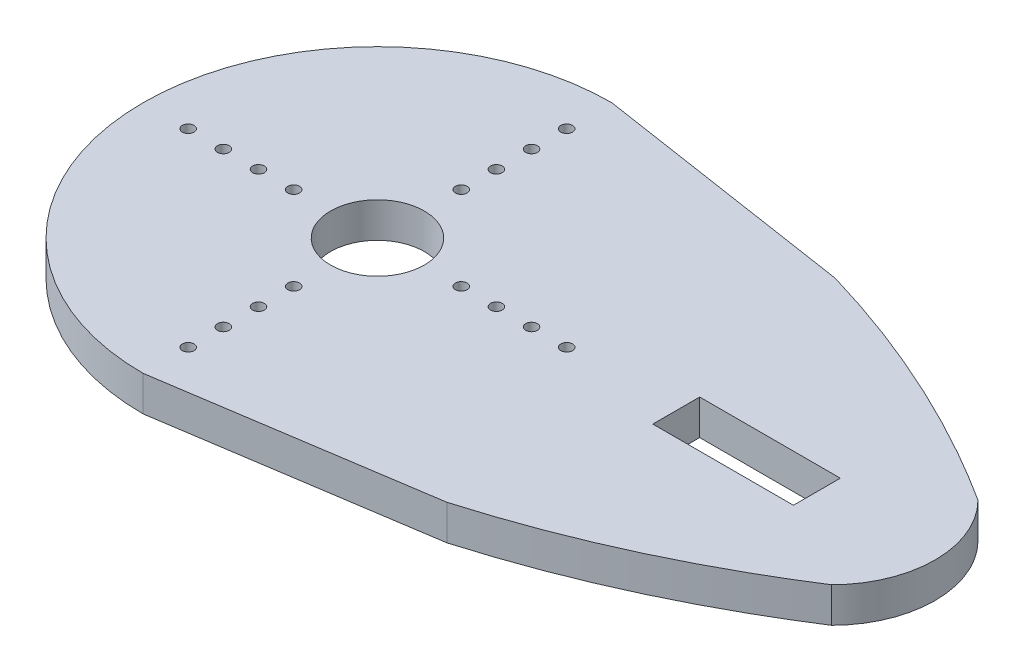
ISO-10303-21;
HEADER;
FILE_DESCRIPTION(('STEP AP214'),'2;1');
FILE_NAME('part.step','',(''),(''),'','','');
FILE_SCHEMA(('AUTOMOTIVE_DESIGN { 1 0 10303 214 1 1 1 1 }'));
ENDSEC;
DATA;
#1=APPLICATION_CONTEXT('core data for automotive mechanical design processes');
#2=APPLICATION_PROTOCOL_DEFINITION('international standard','automotive_design',2000,#1);
#3=PRODUCT_CONTEXT('',#1,'mechanical');
#4=PRODUCT('Part','Part','',(#3));
#5=PRODUCT_RELATED_PRODUCT_CATEGORY('part','',(#4));
#6=PRODUCT_DEFINITION_FORMATION('','',#4);
#7=PRODUCT_DEFINITION_CONTEXT('part definition',#1,'design');
#8=PRODUCT_DEFINITION('design','',#6,#7);
#9=PRODUCT_DEFINITION_SHAPE('','',#8);
#10=(LENGTH_UNIT() NAMED_UNIT(*) SI_UNIT(.MILLI.,.METRE.));
#11=(NAMED_UNIT(*) PLANE_ANGLE_UNIT() SI_UNIT($,.RADIAN.));
#12=(NAMED_UNIT(*) SI_UNIT($,.STERADIAN.) SOLID_ANGLE_UNIT());
#13=UNCERTAINTY_MEASURE_WITH_UNIT(LENGTH_MEASURE(1.E-05),#10,'distance_accuracy_value','');
#14=(GEOMETRIC_REPRESENTATION_CONTEXT(3) GLOBAL_UNCERTAINTY_ASSIGNED_CONTEXT((#13)) GLOBAL_UNIT_ASSIGNED_CONTEXT((#10,
#11,#12)) REPRESENTATION_CONTEXT('',''));
#15=CARTESIAN_POINT('',(0.,0.,0.));
#16=DIRECTION('',(0.,0.,1.));
#17=DIRECTION('',(1.,0.,0.));
#18=AXIS2_PLACEMENT_3D('',#15,#16,#17);
#19=CARTESIAN_POINT('',(0.,3.,2.));
#20=DIRECTION('',(0.,0.,-1.));
#21=DIRECTION('',(-1.,0.,0.));
#22=AXIS2_PLACEMENT_3D('',#19,#20,#21);
#23=PLANE('',#22);
#24=DIRECTION('',(1.,0.,0.));
#25=VECTOR('',#24,1.);
#26=CARTESIAN_POINT('',(0.,0.,2.));
#27=LINE('',#26,#25);
#28=CARTESIAN_POINT('',(25.5,0.,2.));
#29=VERTEX_POINT('',#28);
#30=CARTESIAN_POINT('',(37.5,0.,2.));
#31=VERTEX_POINT('',#30);
#32=EDGE_CURVE('E227',#29,#31,#27,.T.);
#33=ORIENTED_EDGE('',*,*,#32,.F.);
#34=DIRECTION('',(0.,-1.,0.));
#35=VECTOR('',#34,1.);
#36=CARTESIAN_POINT('',(25.5,3.,2.));
#37=LINE('',#36,#35);
#38=CARTESIAN_POINT('',(25.5,3.,2.));
#39=VERTEX_POINT('',#38);
#40=EDGE_CURVE('E11',#39,#29,#37,.T.);
#41=ORIENTED_EDGE('',*,*,#40,.F.);
#42=DIRECTION('',(1.,0.,0.));
#43=VECTOR('',#42,1.);
#44=CARTESIAN_POINT('',(0.,3.,2.));
#45=LINE('',#44,#43);
#46=CARTESIAN_POINT('',(37.5,3.,2.));
#47=VERTEX_POINT('',#46);
#48=EDGE_CURVE('E142',#39,#47,#45,.T.);
#49=ORIENTED_EDGE('',*,*,#48,.T.);
#50=DIRECTION('',(0.,-1.,0.));
#51=VECTOR('',#50,1.);
#52=CARTESIAN_POINT('',(37.5,3.,2.));
#53=LINE('',#52,#51);
#54=EDGE_CURVE('E96',#47,#31,#53,.T.);
#55=ORIENTED_EDGE('',*,*,#54,.T.);
#56=EDGE_LOOP('',(#33,#41,#49,#55));
#57=FACE_BOUND('',#56,.T.);
#58=ADVANCED_FACE('F36',(#57),#23,.T.);
#59=CARTESIAN_POINT('',(25.5,3.,0.));
#60=DIRECTION('',(1.,0.,0.));
#61=DIRECTION('',(0.,0.,-1.));
#62=AXIS2_PLACEMENT_3D('',#59,#60,#61);
#63=PLANE('',#62);
#64=DIRECTION('',(0.,0.,1.));
#65=VECTOR('',#64,1.);
#66=CARTESIAN_POINT('',(25.5,0.,0.));
#67=LINE('',#66,#65);
#68=CARTESIAN_POINT('',(25.5,0.,-2.));
#69=VERTEX_POINT('',#68);
#70=EDGE_CURVE('E131',#69,#29,#67,.T.);
#71=ORIENTED_EDGE('',*,*,#70,.F.);
#72=DIRECTION('',(0.,-1.,0.));
#73=VECTOR('',#72,1.);
#74=CARTESIAN_POINT('',(25.5,3.,-2.));
#75=LINE('',#74,#73);
#76=CARTESIAN_POINT('',(25.5,3.,-2.));
#77=VERTEX_POINT('',#76);
#78=EDGE_CURVE('E46',#77,#69,#75,.T.);
#79=ORIENTED_EDGE('',*,*,#78,.F.);
#80=DIRECTION('',(0.,0.,1.));
#81=VECTOR('',#80,1.);
#82=CARTESIAN_POINT('',(25.5,3.,0.));
#83=LINE('',#82,#81);
#84=EDGE_CURVE('E129',#77,#39,#83,.T.);
#85=ORIENTED_EDGE('',*,*,#84,.T.);
#86=ORIENTED_EDGE('',*,*,#40,.T.);
#87=EDGE_LOOP('',(#71,#79,#85,#86));
#88=FACE_BOUND('',#87,.T.);
#89=ADVANCED_FACE('F127',(#88),#63,.T.);
#90=CARTESIAN_POINT('',(0.,3.,-2.));
#91=DIRECTION('',(0.,0.,-1.));
#92=DIRECTION('',(-1.,0.,0.));
#93=AXIS2_PLACEMENT_3D('',#90,#91,#92);
#94=PLANE('',#93);
#95=DIRECTION('',(1.,0.,0.));
#96=VECTOR('',#95,1.);
#97=CARTESIAN_POINT('',(0.,0.,-2.));
#98=LINE('',#97,#96);
#99=CARTESIAN_POINT('',(37.5,0.,-2.));
#100=VERTEX_POINT('',#99);
#101=EDGE_CURVE('E230',#69,#100,#98,.T.);
#102=ORIENTED_EDGE('',*,*,#101,.T.);
#103=DIRECTION('',(0.,-1.,0.));
#104=VECTOR('',#103,1.);
#105=CARTESIAN_POINT('',(37.5,3.,-2.));
#106=LINE('',#105,#104);
#107=CARTESIAN_POINT('',(37.5,3.,-2.));
#108=VERTEX_POINT('',#107);
#109=EDGE_CURVE('E134',#108,#100,#106,.T.);
#110=ORIENTED_EDGE('',*,*,#109,.F.);
#111=DIRECTION('',(1.,0.,0.));
#112=VECTOR('',#111,1.);
#113=CARTESIAN_POINT('',(0.,3.,-2.));
#114=LINE('',#113,#112);
#115=EDGE_CURVE('E137',#77,#108,#114,.T.);
#116=ORIENTED_EDGE('',*,*,#115,.F.);
#117=ORIENTED_EDGE('',*,*,#78,.T.);
#118=EDGE_LOOP('',(#102,#110,#116,#117));
#119=FACE_BOUND('',#118,.T.);
#120=ADVANCED_FACE('F138',(#119),#94,.F.);
#121=CARTESIAN_POINT('',(0.,3.,20.));
#122=CARTESIAN_POINT('',(24.387763313693,3.,19.4352610275612));
#123=CARTESIAN_POINT('',(45.,3.,6.25));
#124=B_SPLINE_CURVE_WITH_KNOTS('',2,(#121,#122,#123),.UNSPECIFIED.,.F.,.F.,(3,3),(0.,1.),.UNSPECIFIED.);
#125=DIRECTION('',(0.,-1.,0.));
#126=VECTOR('',#125,1.);
#127=SURFACE_OF_LINEAR_EXTRUSION('',#124,#126);
#128=CARTESIAN_POINT('',(0.,0.,20.));
#129=CARTESIAN_POINT('',(24.387763313693,0.,19.4352610275612));
#130=CARTESIAN_POINT('',(45.,0.,6.25));
#131=B_SPLINE_CURVE_WITH_KNOTS('',2,(#128,#129,#130),.UNSPECIFIED.,.F.,.F.,(3,3),(0.,1.),.UNSPECIFIED.);
#132=CARTESIAN_POINT('',(22.4999998561872,0.,16.5625000219714));
#133=VERTEX_POINT('',#132);
#134=CARTESIAN_POINT('',(45.,0.,6.25));
#135=VERTEX_POINT('',#134);
#136=EDGE_CURVE('E180',#133,#135,#131,.T.);
#137=ORIENTED_EDGE('',*,*,#136,.T.);
#138=DIRECTION('',(0.,-1.,0.));
#139=VECTOR('',#138,1.);
#140=CARTESIAN_POINT('',(45.,3.,6.25));
#141=LINE('',#140,#139);
#142=CARTESIAN_POINT('',(45.,3.,6.25));
#143=VERTEX_POINT('',#142);
#144=EDGE_CURVE('E40',#143,#135,#141,.T.);
#145=ORIENTED_EDGE('',*,*,#144,.F.);
#146=CARTESIAN_POINT('',(22.4999998561872,3.,16.5625000219714));
#147=VERTEX_POINT('',#146);
#148=EDGE_CURVE('E104',#147,#143,#124,.T.);
#149=ORIENTED_EDGE('',*,*,#148,.F.);
#150=DIRECTION('',(0.,-1.,0.));
#151=VECTOR('',#150,1.);
#152=CARTESIAN_POINT('',(22.4999998561872,3.,16.5625000219714));
#153=LINE('',#152,#151);
#154=EDGE_CURVE('E164',#147,#133,#153,.T.);
#155=ORIENTED_EDGE('',*,*,#154,.T.);
#156=EDGE_LOOP('',(#137,#145,#149,#155));
#157=FACE_BOUND('',#156,.T.);
#158=ADVANCED_FACE('F270',(#157),#127,.F.);
#159=CARTESIAN_POINT('',(38.75,3.,0.));
#160=DIRECTION('',(0.,-1.,0.));
#161=DIRECTION('',(0.,0.,-1.));
#162=AXIS2_PLACEMENT_3D('',#159,#160,#161);
#163=CYLINDRICAL_SURFACE('',#162,8.83883476483185);
#164=CARTESIAN_POINT('',(38.75,0.,0.));
#165=DIRECTION('',(0.,1.,0.));
#166=DIRECTION('',(0.,0.,1.));
#167=AXIS2_PLACEMENT_3D('',#164,#165,#166);
#168=CIRCLE('',#167,8.83883476483185);
#169=CARTESIAN_POINT('',(45.,0.,-6.25));
#170=VERTEX_POINT('',#169);
#171=EDGE_CURVE('E185',#170,#135,#168,.F.);
#172=ORIENTED_EDGE('',*,*,#171,.F.);
#173=DIRECTION('',(0.,-1.,0.));
#174=VECTOR('',#173,1.);
#175=CARTESIAN_POINT('',(45.,3.,-6.25));
#176=LINE('',#175,#174);
#177=CARTESIAN_POINT('',(45.,3.,-6.25));
#178=VERTEX_POINT('',#177);
#179=EDGE_CURVE('E259',#178,#170,#176,.T.);
#180=ORIENTED_EDGE('',*,*,#179,.F.);
#181=CARTESIAN_POINT('',(38.75,3.,0.));
#182=DIRECTION('',(0.,1.,0.));
#183=DIRECTION('',(0.,0.,1.));
#184=AXIS2_PLACEMENT_3D('',#181,#182,#183);
#185=CIRCLE('',#184,8.83883476483185);
#186=EDGE_CURVE('E267',#178,#143,#185,.F.);
#187=ORIENTED_EDGE('',*,*,#186,.T.);
#188=ORIENTED_EDGE('',*,*,#144,.T.);
#189=EDGE_LOOP('',(#172,#180,#187,#188));
#190=FACE_BOUND('',#189,.T.);
#191=ADVANCED_FACE('F266',(#190),#163,.T.);
#192=CARTESIAN_POINT('',(0.,3.,-20.));
#193=CARTESIAN_POINT('',(24.387763313693,3.,-19.4352610275612));
#194=CARTESIAN_POINT('',(45.,3.,-6.25));
#195=B_SPLINE_CURVE_WITH_KNOTS('',2,(#192,#193,#194),.UNSPECIFIED.,.F.,.F.,(3,3),(0.,1.),.UNSPECIFIED.);
#196=DIRECTION('',(0.,-1.,0.));
#197=VECTOR('',#196,1.);
#198=SURFACE_OF_LINEAR_EXTRUSION('',#195,#197);
#199=CARTESIAN_POINT('',(0.,0.,-20.));
#200=CARTESIAN_POINT('',(24.387763313693,0.,-19.4352610275612));
#201=CARTESIAN_POINT('',(45.,0.,-6.25));
#202=B_SPLINE_CURVE_WITH_KNOTS('',2,(#199,#200,#201),.UNSPECIFIED.,.F.,.F.,(3,3),(0.,1.),.UNSPECIFIED.);
#203=CARTESIAN_POINT('',(22.4999998561872,0.,-16.5625000219714));
#204=VERTEX_POINT('',#203);
#205=EDGE_CURVE('E191',#204,#170,#202,.T.);
#206=ORIENTED_EDGE('',*,*,#205,.F.);
#207=DIRECTION('',(0.,-1.,0.));
#208=VECTOR('',#207,1.);
#209=CARTESIAN_POINT('',(22.4999998561872,3.,-16.5625000219714));
#210=LINE('',#209,#208);
#211=CARTESIAN_POINT('',(22.4999998561872,3.,-16.5625000219714));
#212=VERTEX_POINT('',#211);
#213=EDGE_CURVE('E258',#212,#204,#210,.T.);
#214=ORIENTED_EDGE('',*,*,#213,.F.);
#215=EDGE_CURVE('E280',#212,#178,#195,.T.);
#216=ORIENTED_EDGE('',*,*,#215,.T.);
#217=ORIENTED_EDGE('',*,*,#179,.T.);
#218=EDGE_LOOP('',(#206,#214,#216,#217));
#219=FACE_BOUND('',#218,.T.);
#220=ADVANCED_FACE('F278',(#219),#198,.T.);
#221=CARTESIAN_POINT('',(2.98586239396795,3.,-19.5438265786993));
#222=DIRECTION('',(0.151025398741513,0.,-0.988529882671721));
#223=DIRECTION('',(-0.988529882671721,0.,-0.151025398741513));
#224=AXIS2_PLACEMENT_3D('',#221,#222,#223);
#225=PLANE('',#224);
#226=DIRECTION('',(0.988529882671721,0.,0.151025398741513));
#227=VECTOR('',#226,1.);
#228=CARTESIAN_POINT('',(2.98586239396795,0.,-19.5438265786993));
#229=LINE('',#228,#227);
#230=CARTESIAN_POINT('',(0.,0.,-20.));
#231=VERTEX_POINT('',#230);
#232=EDGE_CURVE('E196',#231,#204,#229,.T.);
#233=ORIENTED_EDGE('',*,*,#232,.F.);
#234=DIRECTION('',(0.,-1.,0.));
#235=VECTOR('',#234,1.);
#236=CARTESIAN_POINT('',(0.,3.,-20.));
#237=LINE('',#236,#235);
#238=CARTESIAN_POINT('',(0.,3.,-20.));
#239=VERTEX_POINT('',#238);
#240=EDGE_CURVE('E256',#239,#231,#237,.T.);
#241=ORIENTED_EDGE('',*,*,#240,.F.);
#242=DIRECTION('',(0.988529882671721,0.,0.151025398741513));
#243=VECTOR('',#242,1.);
#244=CARTESIAN_POINT('',(2.98586239396795,3.,-19.5438265786993));
#245=LINE('',#244,#243);
#246=EDGE_CURVE('E285',#239,#212,#245,.T.);
#247=ORIENTED_EDGE('',*,*,#246,.T.);
#248=ORIENTED_EDGE('',*,*,#213,.T.);
#249=EDGE_LOOP('',(#233,#241,#247,#248));
#250=FACE_BOUND('',#249,.T.);
#251=ADVANCED_FACE('F287',(#250),#225,.T.);
#252=CARTESIAN_POINT('',(0.,3.,0.));
#253=DIRECTION('',(0.,-1.,0.));
#254=DIRECTION('',(0.,0.,-1.));
#255=AXIS2_PLACEMENT_3D('',#252,#253,#254);
#256=CYLINDRICAL_SURFACE('',#255,20.);
#257=CARTESIAN_POINT('',(0.,0.,0.));
#258=DIRECTION('',(0.,1.,0.));
#259=DIRECTION('',(0.,0.,1.));
#260=AXIS2_PLACEMENT_3D('',#257,#258,#259);
#261=CIRCLE('',#260,20.);
#262=CARTESIAN_POINT('',(0.,0.,20.));
#263=VERTEX_POINT('',#262);
#264=EDGE_CURVE('E202',#231,#263,#261,.T.);
#265=ORIENTED_EDGE('',*,*,#264,.T.);
#266=DIRECTION('',(0.,-1.,0.));
#267=VECTOR('',#266,1.);
#268=CARTESIAN_POINT('',(0.,3.,20.));
#269=LINE('',#268,#267);
#270=CARTESIAN_POINT('',(0.,3.,20.));
#271=VERTEX_POINT('',#270);
#272=EDGE_CURVE('E253',#271,#263,#269,.T.);
#273=ORIENTED_EDGE('',*,*,#272,.F.);
#274=CARTESIAN_POINT('',(0.,3.,0.));
#275=DIRECTION('',(0.,1.,0.));
#276=DIRECTION('',(0.,0.,1.));
#277=AXIS2_PLACEMENT_3D('',#274,#275,#276);
#278=CIRCLE('',#277,20.);
#279=EDGE_CURVE('E289',#239,#271,#278,.T.);
#280=ORIENTED_EDGE('',*,*,#279,.F.);
#281=ORIENTED_EDGE('',*,*,#240,.T.);
#282=EDGE_LOOP('',(#265,#273,#280,#281));
#283=FACE_BOUND('',#282,.T.);
#284=ADVANCED_FACE('F376',(#283),#256,.T.);
#285=CARTESIAN_POINT('',(-13.15,3.,0.));
#286=DIRECTION('',(0.,-1.,0.));
#287=DIRECTION('',(0.,0.,-1.));
#288=AXIS2_PLACEMENT_3D('',#285,#286,#287);
#289=CYLINDRICAL_SURFACE('',#288,0.500000000000001);
#290=CARTESIAN_POINT('',(-13.15,3.,0.));
#291=DIRECTION('',(0.,1.,0.));
#292=DIRECTION('',(0.,0.,1.));
#293=AXIS2_PLACEMENT_3D('',#290,#291,#292);
#294=CIRCLE('',#293,0.500000000000001);
#295=CARTESIAN_POINT('',(-13.15,3.,0.500000000000001));
#296=VERTEX_POINT('',#295);
#297=EDGE_CURVE('E158',#296,#296,#294,.T.);
#298=ORIENTED_EDGE('',*,*,#297,.T.);
#299=EDGE_LOOP('',(#298));
#300=FACE_BOUND('',#299,.T.);
#301=CARTESIAN_POINT('',(-13.15,0.,0.));
#302=DIRECTION('',(0.,1.,0.));
#303=DIRECTION('',(0.,0.,1.));
#304=AXIS2_PLACEMENT_3D('',#301,#302,#303);
#305=CIRCLE('',#304,0.500000000000001);
#306=CARTESIAN_POINT('',(-13.15,0.,0.500000000000001));
#307=VERTEX_POINT('',#306);
#308=EDGE_CURVE('E242',#307,#307,#305,.T.);
#309=ORIENTED_EDGE('',*,*,#308,.F.);
#310=EDGE_LOOP('',(#309));
#311=FACE_BOUND('',#310,.T.);
#312=ADVANCED_FACE('F379',(#300,#311),#289,.F.);
#313=CARTESIAN_POINT('',(-10.15,3.,0.));
#314=DIRECTION('',(0.,-1.,0.));
#315=DIRECTION('',(0.,0.,-1.));
#316=AXIS2_PLACEMENT_3D('',#313,#314,#315);
#317=CYLINDRICAL_SURFACE('',#316,0.500000000000001);
#318=CARTESIAN_POINT('',(-10.15,3.,0.));
#319=DIRECTION('',(0.,1.,0.));
#320=DIRECTION('',(0.,0.,1.));
#321=AXIS2_PLACEMENT_3D('',#318,#319,#320);
#322=CIRCLE('',#321,0.500000000000001);
#323=CARTESIAN_POINT('',(-10.15,3.,0.500000000000001));
#324=VERTEX_POINT('',#323);
#325=EDGE_CURVE('E155',#324,#324,#322,.T.);
#326=ORIENTED_EDGE('',*,*,#325,.T.);
#327=EDGE_LOOP('',(#326));
#328=FACE_BOUND('',#327,.T.);
#329=CARTESIAN_POINT('',(-10.15,0.,0.));
#330=DIRECTION('',(0.,1.,0.));
#331=DIRECTION('',(0.,0.,1.));
#332=AXIS2_PLACEMENT_3D('',#329,#330,#331);
#333=CIRCLE('',#332,0.500000000000001);
#334=CARTESIAN_POINT('',(-10.15,0.,0.500000000000001));
#335=VERTEX_POINT('',#334);
#336=EDGE_CURVE('E239',#335,#335,#333,.T.);
#337=ORIENTED_EDGE('',*,*,#336,.F.);
#338=EDGE_LOOP('',(#337));
#339=FACE_BOUND('',#338,.T.);
#340=ADVANCED_FACE('F574',(#328,#339),#317,.F.);
#341=CARTESIAN_POINT('',(-7.15,3.,0.));
#342=DIRECTION('',(0.,-1.,0.));
#343=DIRECTION('',(0.,0.,-1.));
#344=AXIS2_PLACEMENT_3D('',#341,#342,#343);
#345=CYLINDRICAL_SURFACE('',#344,0.500000000000001);
#346=CARTESIAN_POINT('',(-7.15,3.,0.));
#347=DIRECTION('',(0.,1.,0.));
#348=DIRECTION('',(0.,0.,1.));
#349=AXIS2_PLACEMENT_3D('',#346,#347,#348);
#350=CIRCLE('',#349,0.500000000000001);
#351=CARTESIAN_POINT('',(-7.15,3.,0.5));
#352=VERTEX_POINT('',#351);
#353=EDGE_CURVE('E152',#352,#352,#350,.T.);
#354=ORIENTED_EDGE('',*,*,#353,.T.);
#355=EDGE_LOOP('',(#354));
#356=FACE_BOUND('',#355,.T.);
#357=CARTESIAN_POINT('',(-7.15,0.,0.));
#358=DIRECTION('',(0.,1.,0.));
#359=DIRECTION('',(0.,0.,1.));
#360=AXIS2_PLACEMENT_3D('',#357,#358,#359);
#361=CIRCLE('',#360,0.500000000000001);
#362=CARTESIAN_POINT('',(-7.15,0.,0.5));
#363=VERTEX_POINT('',#362);
#364=EDGE_CURVE('E236',#363,#363,#361,.T.);
#365=ORIENTED_EDGE('',*,*,#364,.F.);
#366=EDGE_LOOP('',(#365));
#367=FACE_BOUND('',#366,.T.);
#368=ADVANCED_FACE('F565',(#356,#367),#345,.F.);
#369=CARTESIAN_POINT('',(0.,3.,-7.15));
#370=DIRECTION('',(0.,-1.,0.));
#371=DIRECTION('',(0.,0.,-1.));
#372=AXIS2_PLACEMENT_3D('',#369,#370,#371);
#373=CYLINDRICAL_SURFACE('',#372,0.500000000000001);
#374=CARTESIAN_POINT('',(0.,3.,-7.15));
#375=DIRECTION('',(0.,1.,0.));
#376=DIRECTION('',(0.,0.,1.));
#377=AXIS2_PLACEMENT_3D('',#374,#375,#376);
#378=CIRCLE('',#377,0.500000000000001);
#379=CARTESIAN_POINT('',(0.,3.,-6.65));
#380=VERTEX_POINT('',#379);
#381=EDGE_CURVE('E149',#380,#380,#378,.T.);
#382=ORIENTED_EDGE('',*,*,#381,.T.);
#383=EDGE_LOOP('',(#382));
#384=FACE_BOUND('',#383,.T.);
#385=CARTESIAN_POINT('',(0.,0.,-7.15));
#386=DIRECTION('',(0.,1.,0.));
#387=DIRECTION('',(0.,0.,1.));
#388=AXIS2_PLACEMENT_3D('',#385,#386,#387);
#389=CIRCLE('',#388,0.500000000000001);
#390=CARTESIAN_POINT('',(0.,0.,-6.65));
#391=VERTEX_POINT('',#390);
#392=EDGE_CURVE('E233',#391,#391,#389,.T.);
#393=ORIENTED_EDGE('',*,*,#392,.F.);
#394=EDGE_LOOP('',(#393));
#395=FACE_BOUND('',#394,.T.);
#396=ADVANCED_FACE('F556',(#384,#395),#373,.F.);
#397=CARTESIAN_POINT('',(37.5,3.,0.));
#398=DIRECTION('',(1.,0.,0.));
#399=DIRECTION('',(0.,0.,-1.));
#400=AXIS2_PLACEMENT_3D('',#397,#398,#399);
#401=PLANE('',#400);
#402=DIRECTION('',(0.,0.,1.));
#403=VECTOR('',#402,1.);
#404=CARTESIAN_POINT('',(37.5,0.,0.));
#405=LINE('',#404,#403);
#406=EDGE_CURVE('E89',#100,#31,#405,.T.);
#407=ORIENTED_EDGE('',*,*,#406,.T.);
#408=ORIENTED_EDGE('',*,*,#54,.F.);
#409=DIRECTION('',(0.,0.,1.));
#410=VECTOR('',#409,1.);
#411=CARTESIAN_POINT('',(37.5,3.,0.));
#412=LINE('',#411,#410);
#413=EDGE_CURVE('E55',#108,#47,#412,.T.);
#414=ORIENTED_EDGE('',*,*,#413,.F.);
#415=ORIENTED_EDGE('',*,*,#109,.T.);
#416=EDGE_LOOP('',(#407,#408,#414,#415));
#417=FACE_BOUND('',#416,.T.);
#418=ADVANCED_FACE('F347',(#417),#401,.F.);
#419=CARTESIAN_POINT('',(16.15,3.,1.12396237623543E-13));
#420=DIRECTION('',(0.,-1.,0.));
#421=DIRECTION('',(0.,0.,-1.));
#422=AXIS2_PLACEMENT_3D('',#419,#420,#421);
#423=CYLINDRICAL_SURFACE('',#422,0.499999999999998);
#424=CARTESIAN_POINT('',(16.15,3.,1.12396237623543E-13));
#425=DIRECTION('',(0.,1.,0.));
#426=DIRECTION('',(0.,0.,1.));
#427=AXIS2_PLACEMENT_3D('',#424,#425,#426);
#428=CIRCLE('',#427,0.499999999999998);
#429=CARTESIAN_POINT('',(16.15,3.,0.500000000000111));
#430=VERTEX_POINT('',#429);
#431=EDGE_CURVE('E144',#430,#430,#428,.T.);
#432=ORIENTED_EDGE('',*,*,#431,.T.);
#433=EDGE_LOOP('',(#432));
#434=FACE_BOUND('',#433,.T.);
#435=CARTESIAN_POINT('',(16.15,0.,1.12396237623543E-13));
#436=DIRECTION('',(0.,1.,0.));
#437=DIRECTION('',(0.,0.,1.));
#438=AXIS2_PLACEMENT_3D('',#435,#436,#437);
#439=CIRCLE('',#438,0.499999999999998);
#440=CARTESIAN_POINT('',(16.15,0.,0.500000000000111));
#441=VERTEX_POINT('',#440);
#442=EDGE_CURVE('E224',#441,#441,#439,.T.);
#443=ORIENTED_EDGE('',*,*,#442,.F.);
#444=EDGE_LOOP('',(#443));
#445=FACE_BOUND('',#444,.T.);
#446=ADVANCED_FACE('F319',(#434,#445),#423,.F.);
#447=CARTESIAN_POINT('',(13.15,3.,0.));
#448=DIRECTION('',(0.,-1.,0.));
#449=DIRECTION('',(0.,0.,-1.));
#450=AXIS2_PLACEMENT_3D('',#447,#448,#449);
#451=CYLINDRICAL_SURFACE('',#450,0.500000000000001);
#452=CARTESIAN_POINT('',(13.15,3.,0.));
#453=DIRECTION('',(0.,1.,0.));
#454=DIRECTION('',(0.,0.,1.));
#455=AXIS2_PLACEMENT_3D('',#452,#453,#454);
#456=CIRCLE('',#455,0.500000000000001);
#457=CARTESIAN_POINT('',(13.15,3.,0.500000000000093));
#458=VERTEX_POINT('',#457);
#459=EDGE_CURVE('E314',#458,#458,#456,.T.);
#460=ORIENTED_EDGE('',*,*,#459,.T.);
#461=EDGE_LOOP('',(#460));
#462=FACE_BOUND('',#461,.T.);
#463=CARTESIAN_POINT('',(13.15,0.,0.));
#464=DIRECTION('',(0.,1.,0.));
#465=DIRECTION('',(0.,0.,1.));
#466=AXIS2_PLACEMENT_3D('',#463,#464,#465);
#467=CIRCLE('',#466,0.500000000000001);
#468=CARTESIAN_POINT('',(13.15,0.,0.500000000000093));
#469=VERTEX_POINT('',#468);
#470=EDGE_CURVE('E221',#469,#469,#467,.T.);
#471=ORIENTED_EDGE('',*,*,#470,.F.);
#472=EDGE_LOOP('',(#471));
#473=FACE_BOUND('',#472,.T.);
#474=ADVANCED_FACE('F346',(#462,#473),#451,.F.);
#475=CARTESIAN_POINT('',(10.15,3.,0.));
#476=DIRECTION('',(0.,-1.,0.));
#477=DIRECTION('',(0.,0.,-1.));
#478=AXIS2_PLACEMENT_3D('',#475,#476,#477);
#479=CYLINDRICAL_SURFACE('',#478,0.500000000000001);
#480=CARTESIAN_POINT('',(10.15,3.,0.));
#481=DIRECTION('',(0.,1.,0.));
#482=DIRECTION('',(0.,0.,1.));
#483=AXIS2_PLACEMENT_3D('',#480,#481,#482);
#484=CIRCLE('',#483,0.500000000000001);
#485=CARTESIAN_POINT('',(10.15,3.,0.500000000000072));
#486=VERTEX_POINT('',#485);
#487=EDGE_CURVE('E311',#486,#486,#484,.T.);
#488=ORIENTED_EDGE('',*,*,#487,.T.);
#489=EDGE_LOOP('',(#488));
#490=FACE_BOUND('',#489,.T.);
#491=CARTESIAN_POINT('',(10.15,0.,0.));
#492=DIRECTION('',(0.,1.,0.));
#493=DIRECTION('',(0.,0.,1.));
#494=AXIS2_PLACEMENT_3D('',#491,#492,#493);
#495=CIRCLE('',#494,0.500000000000001);
#496=CARTESIAN_POINT('',(10.15,0.,0.500000000000072));
#497=VERTEX_POINT('',#496);
#498=EDGE_CURVE('E218',#497,#497,#495,.T.);
#499=ORIENTED_EDGE('',*,*,#498,.F.);
#500=EDGE_LOOP('',(#499));
#501=FACE_BOUND('',#500,.T.);
#502=ADVANCED_FACE('F350',(#490,#501),#479,.F.);
#503=CARTESIAN_POINT('',(7.15,3.,0.));
#504=DIRECTION('',(0.,-1.,0.));
#505=DIRECTION('',(0.,0.,-1.));
#506=AXIS2_PLACEMENT_3D('',#503,#504,#505);
#507=CYLINDRICAL_SURFACE('',#506,0.500000000000001);
#508=CARTESIAN_POINT('',(7.15,3.,0.));
#509=DIRECTION('',(0.,1.,0.));
#510=DIRECTION('',(0.,0.,1.));
#511=AXIS2_PLACEMENT_3D('',#508,#509,#510);
#512=CIRCLE('',#511,0.500000000000001);
#513=CARTESIAN_POINT('',(7.15,3.,0.500000000000051));
#514=VERTEX_POINT('',#513);
#515=EDGE_CURVE('E308',#514,#514,#512,.T.);
#516=ORIENTED_EDGE('',*,*,#515,.T.);
#517=EDGE_LOOP('',(#516));
#518=FACE_BOUND('',#517,.T.);
#519=CARTESIAN_POINT('',(7.15,0.,0.));
#520=DIRECTION('',(0.,1.,0.));
#521=DIRECTION('',(0.,0.,1.));
#522=AXIS2_PLACEMENT_3D('',#519,#520,#521);
#523=CIRCLE('',#522,0.500000000000001);
#524=CARTESIAN_POINT('',(7.15,0.,0.500000000000051));
#525=VERTEX_POINT('',#524);
#526=EDGE_CURVE('E215',#525,#525,#523,.T.);
#527=ORIENTED_EDGE('',*,*,#526,.F.);
#528=EDGE_LOOP('',(#527));
#529=FACE_BOUND('',#528,.T.);
#530=ADVANCED_FACE('F354',(#518,#529),#507,.F.);
#531=CARTESIAN_POINT('',(0.,3.,-10.15));
#532=DIRECTION('',(0.,-1.,0.));
#533=DIRECTION('',(0.,0.,-1.));
#534=AXIS2_PLACEMENT_3D('',#531,#532,#533);
#535=CYLINDRICAL_SURFACE('',#534,0.5);
#536=CARTESIAN_POINT('',(0.,3.,-10.15));
#537=DIRECTION('',(0.,1.,0.));
#538=DIRECTION('',(0.,0.,1.));
#539=AXIS2_PLACEMENT_3D('',#536,#537,#538);
#540=CIRCLE('',#539,0.5);
#541=CARTESIAN_POINT('',(0.,3.,-9.65));
#542=VERTEX_POINT('',#541);
#543=EDGE_CURVE('E305',#542,#542,#540,.T.);
#544=ORIENTED_EDGE('',*,*,#543,.T.);
#545=EDGE_LOOP('',(#544));
#546=FACE_BOUND('',#545,.T.);
#547=CARTESIAN_POINT('',(0.,0.,-10.15));
#548=DIRECTION('',(0.,1.,0.));
#549=DIRECTION('',(0.,0.,1.));
#550=AXIS2_PLACEMENT_3D('',#547,#548,#549);
#551=CIRCLE('',#550,0.5);
#552=CARTESIAN_POINT('',(0.,0.,-9.65));
#553=VERTEX_POINT('',#552);
#554=EDGE_CURVE('E212',#553,#553,#551,.T.);
#555=ORIENTED_EDGE('',*,*,#554,.F.);
#556=EDGE_LOOP('',(#555));
#557=FACE_BOUND('',#556,.T.);
#558=ADVANCED_FACE('F358',(#546,#557),#535,.F.);
#559=CARTESIAN_POINT('',(0.,3.,-13.15));
#560=DIRECTION('',(0.,-1.,0.));
#561=DIRECTION('',(0.,0.,-1.));
#562=AXIS2_PLACEMENT_3D('',#559,#560,#561);
#563=CYLINDRICAL_SURFACE('',#562,0.5);
#564=CARTESIAN_POINT('',(0.,3.,-13.15));
#565=DIRECTION('',(0.,1.,0.));
#566=DIRECTION('',(0.,0.,1.));
#567=AXIS2_PLACEMENT_3D('',#564,#565,#566);
#568=CIRCLE('',#567,0.5);
#569=CARTESIAN_POINT('',(0.,3.,-12.65));
#570=VERTEX_POINT('',#569);
#571=EDGE_CURVE('E302',#570,#570,#568,.T.);
#572=ORIENTED_EDGE('',*,*,#571,.T.);
#573=EDGE_LOOP('',(#572));
#574=FACE_BOUND('',#573,.T.);
#575=CARTESIAN_POINT('',(0.,0.,-13.15));
#576=DIRECTION('',(0.,1.,0.));
#577=DIRECTION('',(0.,0.,1.));
#578=AXIS2_PLACEMENT_3D('',#575,#576,#577);
#579=CIRCLE('',#578,0.5);
#580=CARTESIAN_POINT('',(0.,0.,-12.65));
#581=VERTEX_POINT('',#580);
#582=EDGE_CURVE('E209',#581,#581,#579,.T.);
#583=ORIENTED_EDGE('',*,*,#582,.F.);
#584=EDGE_LOOP('',(#583));
#585=FACE_BOUND('',#584,.T.);
#586=ADVANCED_FACE('F362',(#574,#585),#563,.F.);
#587=CARTESIAN_POINT('',(0.,3.,-16.15));
#588=DIRECTION('',(0.,-1.,0.));
#589=DIRECTION('',(0.,0.,-1.));
#590=AXIS2_PLACEMENT_3D('',#587,#588,#589);
#591=CYLINDRICAL_SURFACE('',#590,0.499999999999999);
#592=CARTESIAN_POINT('',(0.,3.,-16.15));
#593=DIRECTION('',(0.,1.,0.));
#594=DIRECTION('',(0.,0.,1.));
#595=AXIS2_PLACEMENT_3D('',#592,#593,#594);
#596=CIRCLE('',#595,0.499999999999999);
#597=CARTESIAN_POINT('',(0.,3.,-15.65));
#598=VERTEX_POINT('',#597);
#599=EDGE_CURVE('E299',#598,#598,#596,.T.);
#600=ORIENTED_EDGE('',*,*,#599,.T.);
#601=EDGE_LOOP('',(#600));
#602=FACE_BOUND('',#601,.T.);
#603=CARTESIAN_POINT('',(0.,0.,-16.15));
#604=DIRECTION('',(0.,1.,0.));
#605=DIRECTION('',(0.,0.,1.));
#606=AXIS2_PLACEMENT_3D('',#603,#604,#605);
#607=CIRCLE('',#606,0.499999999999999);
#608=CARTESIAN_POINT('',(0.,0.,-15.65));
#609=VERTEX_POINT('',#608);
#610=EDGE_CURVE('E206',#609,#609,#607,.T.);
#611=ORIENTED_EDGE('',*,*,#610,.F.);
#612=EDGE_LOOP('',(#611));
#613=FACE_BOUND('',#612,.T.);
#614=ADVANCED_FACE('F366',(#602,#613),#591,.F.);
#615=CARTESIAN_POINT('',(2.98586239396795,3.,19.5438265786993));
#616=DIRECTION('',(-0.151025398741513,0.,-0.988529882671721));
#617=DIRECTION('',(-0.988529882671721,0.,0.151025398741513));
#618=AXIS2_PLACEMENT_3D('',#615,#616,#617);
#619=PLANE('',#618);
#620=DIRECTION('',(0.988529882671721,0.,-0.151025398741513));
#621=VECTOR('',#620,1.);
#622=CARTESIAN_POINT('',(2.98586239396795,0.,19.5438265786993));
#623=LINE('',#622,#621);
#624=EDGE_CURVE('E204',#263,#133,#623,.T.);
#625=ORIENTED_EDGE('',*,*,#624,.T.);
#626=ORIENTED_EDGE('',*,*,#154,.F.);
#627=DIRECTION('',(0.988529882671721,0.,-0.151025398741513));
#628=VECTOR('',#627,1.);
#629=CARTESIAN_POINT('',(2.98586239396795,3.,19.5438265786993));
#630=LINE('',#629,#628);
#631=EDGE_CURVE('E291',#271,#147,#630,.T.);
#632=ORIENTED_EDGE('',*,*,#631,.F.);
#633=ORIENTED_EDGE('',*,*,#272,.T.);
#634=EDGE_LOOP('',(#625,#626,#632,#633));
#635=FACE_BOUND('',#634,.T.);
#636=ADVANCED_FACE('F370',(#635),#619,.F.);
#637=CARTESIAN_POINT('',(-1.69651022983848E-13,3.,16.15));
#638=DIRECTION('',(0.,-1.,0.));
#639=DIRECTION('',(0.,0.,-1.));
#640=AXIS2_PLACEMENT_3D('',#637,#638,#639);
#641=CYLINDRICAL_SURFACE('',#640,0.499999999999998);
#642=CARTESIAN_POINT('',(-1.69651022983848E-13,3.,16.15));
#643=DIRECTION('',(0.,1.,0.));
#644=DIRECTION('',(0.,0.,1.));
#645=AXIS2_PLACEMENT_3D('',#642,#643,#644);
#646=CIRCLE('',#645,0.499999999999998);
#647=CARTESIAN_POINT('',(-1.69651022983848E-13,3.,16.65));
#648=VERTEX_POINT('',#647);
#649=EDGE_CURVE('E395',#648,#648,#646,.T.);
#650=ORIENTED_EDGE('',*,*,#649,.T.);
#651=EDGE_LOOP('',(#650));
#652=FACE_BOUND('',#651,.T.);
#653=CARTESIAN_POINT('',(-1.69651022983848E-13,0.,16.15));
#654=DIRECTION('',(0.,1.,0.));
#655=DIRECTION('',(0.,0.,1.));
#656=AXIS2_PLACEMENT_3D('',#653,#654,#655);
#657=CIRCLE('',#656,0.499999999999998);
#658=CARTESIAN_POINT('',(-1.69651022983848E-13,0.,16.65));
#659=VERTEX_POINT('',#658);
#660=EDGE_CURVE('E177',#659,#659,#657,.T.);
#661=ORIENTED_EDGE('',*,*,#660,.F.);
#662=EDGE_LOOP('',(#661));
#663=FACE_BOUND('',#662,.T.);
#664=ADVANCED_FACE('F374',(#652,#663),#641,.F.);
#665=CARTESIAN_POINT('',(-1.38233298724933E-13,3.,13.15));
#666=DIRECTION('',(0.,-1.,0.));
#667=DIRECTION('',(0.,0.,-1.));
#668=AXIS2_PLACEMENT_3D('',#665,#666,#667);
#669=CYLINDRICAL_SURFACE('',#668,0.500000000000001);
#670=CARTESIAN_POINT('',(-1.38233298724933E-13,3.,13.15));
#671=DIRECTION('',(0.,1.,0.));
#672=DIRECTION('',(0.,0.,1.));
#673=AXIS2_PLACEMENT_3D('',#670,#671,#672);
#674=CIRCLE('',#673,0.500000000000001);
#675=CARTESIAN_POINT('',(-1.38233298724933E-13,3.,13.65));
#676=VERTEX_POINT('',#675);
#677=EDGE_CURVE('E401',#676,#676,#674,.T.);
#678=ORIENTED_EDGE('',*,*,#677,.T.);
#679=EDGE_LOOP('',(#678));
#680=FACE_BOUND('',#679,.T.);
#681=CARTESIAN_POINT('',(-1.38233298724933E-13,0.,13.15));
#682=DIRECTION('',(0.,1.,0.));
#683=DIRECTION('',(0.,0.,1.));
#684=AXIS2_PLACEMENT_3D('',#681,#682,#683);
#685=CIRCLE('',#684,0.500000000000001);
#686=CARTESIAN_POINT('',(-1.38233298724933E-13,0.,13.65));
#687=VERTEX_POINT('',#686);
#688=EDGE_CURVE('E174',#687,#687,#685,.T.);
#689=ORIENTED_EDGE('',*,*,#688,.F.);
#690=EDGE_LOOP('',(#689));
#691=FACE_BOUND('',#690,.T.);
#692=ADVANCED_FACE('F426',(#680,#691),#669,.F.);
#693=CARTESIAN_POINT('',(-1.06815574466018E-13,3.,10.15));
#694=DIRECTION('',(0.,-1.,0.));
#695=DIRECTION('',(0.,0.,-1.));
#696=AXIS2_PLACEMENT_3D('',#693,#694,#695);
#697=CYLINDRICAL_SURFACE('',#696,0.500000000000001);
#698=CARTESIAN_POINT('',(-1.06815574466018E-13,3.,10.15));
#699=DIRECTION('',(0.,1.,0.));
#700=DIRECTION('',(0.,0.,1.));
#701=AXIS2_PLACEMENT_3D('',#698,#699,#700);
#702=CIRCLE('',#701,0.500000000000001);
#703=CARTESIAN_POINT('',(-1.06815574466018E-13,3.,10.65));
#704=VERTEX_POINT('',#703);
#705=EDGE_CURVE('E404',#704,#704,#702,.T.);
#706=ORIENTED_EDGE('',*,*,#705,.T.);
#707=EDGE_LOOP('',(#706));
#708=FACE_BOUND('',#707,.T.);
#709=CARTESIAN_POINT('',(-1.06815574466018E-13,0.,10.15));
#710=DIRECTION('',(0.,1.,0.));
#711=DIRECTION('',(0.,0.,1.));
#712=AXIS2_PLACEMENT_3D('',#709,#710,#711);
#713=CIRCLE('',#712,0.500000000000001);
#714=CARTESIAN_POINT('',(-1.06815574466018E-13,0.,10.65));
#715=VERTEX_POINT('',#714);
#716=EDGE_CURVE('E171',#715,#715,#713,.T.);
#717=ORIENTED_EDGE('',*,*,#716,.F.);
#718=EDGE_LOOP('',(#717));
#719=FACE_BOUND('',#718,.T.);
#720=ADVANCED_FACE('F431',(#708,#719),#697,.F.);
#721=CARTESIAN_POINT('',(0.,3.,7.15));
#722=DIRECTION('',(0.,-1.,0.));
#723=DIRECTION('',(0.,0.,-1.));
#724=AXIS2_PLACEMENT_3D('',#721,#722,#723);
#725=CYLINDRICAL_SURFACE('',#724,0.500000000000001);
#726=CARTESIAN_POINT('',(0.,3.,7.15));
#727=DIRECTION('',(0.,1.,0.));
#728=DIRECTION('',(0.,0.,1.));
#729=AXIS2_PLACEMENT_3D('',#726,#727,#728);
#730=CIRCLE('',#729,0.500000000000001);
#731=CARTESIAN_POINT('',(0.,3.,7.65));
#732=VERTEX_POINT('',#731);
#733=EDGE_CURVE('E407',#732,#732,#730,.T.);
#734=ORIENTED_EDGE('',*,*,#733,.T.);
#735=EDGE_LOOP('',(#734));
#736=FACE_BOUND('',#735,.T.);
#737=CARTESIAN_POINT('',(0.,0.,7.15));
#738=DIRECTION('',(0.,1.,0.));
#739=DIRECTION('',(0.,0.,1.));
#740=AXIS2_PLACEMENT_3D('',#737,#738,#739);
#741=CIRCLE('',#740,0.500000000000001);
#742=CARTESIAN_POINT('',(0.,0.,7.65));
#743=VERTEX_POINT('',#742);
#744=EDGE_CURVE('E168',#743,#743,#741,.T.);
#745=ORIENTED_EDGE('',*,*,#744,.F.);
#746=EDGE_LOOP('',(#745));
#747=FACE_BOUND('',#746,.T.);
#748=ADVANCED_FACE('F414',(#736,#747),#725,.F.);
#749=CARTESIAN_POINT('',(0.,3.,0.));
#750=DIRECTION('',(0.,-1.,0.));
#751=DIRECTION('',(0.,0.,-1.));
#752=AXIS2_PLACEMENT_3D('',#749,#750,#751);
#753=CYLINDRICAL_SURFACE('',#752,4.);
#754=CARTESIAN_POINT('',(0.,3.,0.));
#755=DIRECTION('',(0.,1.,0.));
#756=DIRECTION('',(0.,0.,1.));
#757=AXIS2_PLACEMENT_3D('',#754,#755,#756);
#758=CIRCLE('',#757,4.);
#759=CARTESIAN_POINT('',(0.,3.,4.));
#760=VERTEX_POINT('',#759);
#761=EDGE_CURVE('E248',#760,#760,#758,.T.);
#762=ORIENTED_EDGE('',*,*,#761,.T.);
#763=EDGE_LOOP('',(#762));
#764=FACE_BOUND('',#763,.T.);
#765=CARTESIAN_POINT('',(0.,0.,0.));
#766=DIRECTION('',(0.,1.,0.));
#767=DIRECTION('',(0.,0.,1.));
#768=AXIS2_PLACEMENT_3D('',#765,#766,#767);
#769=CIRCLE('',#768,4.);
#770=CARTESIAN_POINT('',(0.,0.,4.));
#771=VERTEX_POINT('',#770);
#772=EDGE_CURVE('E165',#771,#771,#769,.T.);
#773=ORIENTED_EDGE('',*,*,#772,.F.);
#774=EDGE_LOOP('',(#773));
#775=FACE_BOUND('',#774,.T.);
#776=ADVANCED_FACE('F38',(#764,#775),#753,.F.);
#777=CARTESIAN_POINT('',(-16.15,3.,0.));
#778=DIRECTION('',(0.,-1.,0.));
#779=DIRECTION('',(0.,0.,-1.));
#780=AXIS2_PLACEMENT_3D('',#777,#778,#779);
#781=CYLINDRICAL_SURFACE('',#780,0.499999999999999);
#782=CARTESIAN_POINT('',(-16.15,3.,0.));
#783=DIRECTION('',(0.,1.,0.));
#784=DIRECTION('',(0.,0.,1.));
#785=AXIS2_PLACEMENT_3D('',#782,#783,#784);
#786=CIRCLE('',#785,0.499999999999999);
#787=CARTESIAN_POINT('',(-16.15,3.,0.499999999999999));
#788=VERTEX_POINT('',#787);
#789=EDGE_CURVE('E161',#788,#788,#786,.T.);
#790=ORIENTED_EDGE('',*,*,#789,.T.);
#791=EDGE_LOOP('',(#790));
#792=FACE_BOUND('',#791,.T.);
#793=CARTESIAN_POINT('',(-16.15,0.,0.));
#794=DIRECTION('',(0.,1.,0.));
#795=DIRECTION('',(0.,0.,1.));
#796=AXIS2_PLACEMENT_3D('',#793,#794,#795);
#797=CIRCLE('',#796,0.499999999999999);
#798=CARTESIAN_POINT('',(-16.15,0.,0.499999999999999));
#799=VERTEX_POINT('',#798);
#800=EDGE_CURVE('E245',#799,#799,#797,.T.);
#801=ORIENTED_EDGE('',*,*,#800,.F.);
#802=EDGE_LOOP('',(#801));
#803=FACE_BOUND('',#802,.T.);
#804=ADVANCED_FACE('F323',(#792,#803),#781,.F.);
#805=CARTESIAN_POINT('',(0.,3.,0.));
#806=DIRECTION('',(0.,1.,0.));
#807=DIRECTION('',(0.,0.,1.));
#808=AXIS2_PLACEMENT_3D('',#805,#806,#807);
#809=PLANE('',#808);
#810=ORIENTED_EDGE('',*,*,#761,.F.);
#811=EDGE_LOOP('',(#810));
#812=FACE_BOUND('',#811,.T.);
#813=ORIENTED_EDGE('',*,*,#733,.F.);
#814=EDGE_LOOP('',(#813));
#815=FACE_BOUND('',#814,.T.);
#816=ORIENTED_EDGE('',*,*,#705,.F.);
#817=EDGE_LOOP('',(#816));
#818=FACE_BOUND('',#817,.T.);
#819=ORIENTED_EDGE('',*,*,#677,.F.);
#820=EDGE_LOOP('',(#819));
#821=FACE_BOUND('',#820,.T.);
#822=ORIENTED_EDGE('',*,*,#649,.F.);
#823=EDGE_LOOP('',(#822));
#824=FACE_BOUND('',#823,.T.);
#825=ORIENTED_EDGE('',*,*,#148,.T.);
#826=ORIENTED_EDGE('',*,*,#186,.F.);
#827=ORIENTED_EDGE('',*,*,#215,.F.);
#828=ORIENTED_EDGE('',*,*,#246,.F.);
#829=ORIENTED_EDGE('',*,*,#279,.T.);
#830=ORIENTED_EDGE('',*,*,#631,.T.);
#831=EDGE_LOOP('',(#825,#826,#827,#828,#829,#830));
#832=FACE_BOUND('',#831,.T.);
#833=ORIENTED_EDGE('',*,*,#599,.F.);
#834=EDGE_LOOP('',(#833));
#835=FACE_BOUND('',#834,.T.);
#836=ORIENTED_EDGE('',*,*,#571,.F.);
#837=EDGE_LOOP('',(#836));
#838=FACE_BOUND('',#837,.T.);
#839=ORIENTED_EDGE('',*,*,#543,.F.);
#840=EDGE_LOOP('',(#839));
#841=FACE_BOUND('',#840,.T.);
#842=ORIENTED_EDGE('',*,*,#515,.F.);
#843=EDGE_LOOP('',(#842));
#844=FACE_BOUND('',#843,.T.);
#845=ORIENTED_EDGE('',*,*,#487,.F.);
#846=EDGE_LOOP('',(#845));
#847=FACE_BOUND('',#846,.T.);
#848=ORIENTED_EDGE('',*,*,#459,.F.);
#849=EDGE_LOOP('',(#848));
#850=FACE_BOUND('',#849,.T.);
#851=ORIENTED_EDGE('',*,*,#431,.F.);
#852=EDGE_LOOP('',(#851));
#853=FACE_BOUND('',#852,.T.);
#854=ORIENTED_EDGE('',*,*,#48,.F.);
#855=ORIENTED_EDGE('',*,*,#84,.F.);
#856=ORIENTED_EDGE('',*,*,#115,.T.);
#857=ORIENTED_EDGE('',*,*,#413,.T.);
#858=EDGE_LOOP('',(#854,#855,#856,#857));
#859=FACE_BOUND('',#858,.T.);
#860=ORIENTED_EDGE('',*,*,#381,.F.);
#861=EDGE_LOOP('',(#860));
#862=FACE_BOUND('',#861,.T.);
#863=ORIENTED_EDGE('',*,*,#353,.F.);
#864=EDGE_LOOP('',(#863));
#865=FACE_BOUND('',#864,.T.);
#866=ORIENTED_EDGE('',*,*,#325,.F.);
#867=EDGE_LOOP('',(#866));
#868=FACE_BOUND('',#867,.T.);
#869=ORIENTED_EDGE('',*,*,#297,.F.);
#870=EDGE_LOOP('',(#869));
#871=FACE_BOUND('',#870,.T.);
#872=ORIENTED_EDGE('',*,*,#789,.F.);
#873=EDGE_LOOP('',(#872));
#874=FACE_BOUND('',#873,.T.);
#875=ADVANCED_FACE('F140',(#812,#815,#818,#821,#824,#832,#835,#838,#841,#844,#847,#850,#853,
#859,#862,#865,#868,#871,#874),#809,.T.);
#876=CARTESIAN_POINT('',(0.,0.,0.));
#877=DIRECTION('',(0.,1.,0.));
#878=DIRECTION('',(0.,0.,1.));
#879=AXIS2_PLACEMENT_3D('',#876,#877,#878);
#880=PLANE('',#879);
#881=ORIENTED_EDGE('',*,*,#772,.T.);
#882=EDGE_LOOP('',(#881));
#883=FACE_BOUND('',#882,.T.);
#884=ORIENTED_EDGE('',*,*,#744,.T.);
#885=EDGE_LOOP('',(#884));
#886=FACE_BOUND('',#885,.T.);
#887=ORIENTED_EDGE('',*,*,#716,.T.);
#888=EDGE_LOOP('',(#887));
#889=FACE_BOUND('',#888,.T.);
#890=ORIENTED_EDGE('',*,*,#688,.T.);
#891=EDGE_LOOP('',(#890));
#892=FACE_BOUND('',#891,.T.);
#893=ORIENTED_EDGE('',*,*,#660,.T.);
#894=EDGE_LOOP('',(#893));
#895=FACE_BOUND('',#894,.T.);
#896=ORIENTED_EDGE('',*,*,#136,.F.);
#897=ORIENTED_EDGE('',*,*,#624,.F.);
#898=ORIENTED_EDGE('',*,*,#264,.F.);
#899=ORIENTED_EDGE('',*,*,#232,.T.);
#900=ORIENTED_EDGE('',*,*,#205,.T.);
#901=ORIENTED_EDGE('',*,*,#171,.T.);
#902=EDGE_LOOP('',(#896,#897,#898,#899,#900,#901));
#903=FACE_BOUND('',#902,.T.);
#904=ORIENTED_EDGE('',*,*,#610,.T.);
#905=EDGE_LOOP('',(#904));
#906=FACE_BOUND('',#905,.T.);
#907=ORIENTED_EDGE('',*,*,#582,.T.);
#908=EDGE_LOOP('',(#907));
#909=FACE_BOUND('',#908,.T.);
#910=ORIENTED_EDGE('',*,*,#554,.T.);
#911=EDGE_LOOP('',(#910));
#912=FACE_BOUND('',#911,.T.);
#913=ORIENTED_EDGE('',*,*,#526,.T.);
#914=EDGE_LOOP('',(#913));
#915=FACE_BOUND('',#914,.T.);
#916=ORIENTED_EDGE('',*,*,#498,.T.);
#917=EDGE_LOOP('',(#916));
#918=FACE_BOUND('',#917,.T.);
#919=ORIENTED_EDGE('',*,*,#470,.T.);
#920=EDGE_LOOP('',(#919));
#921=FACE_BOUND('',#920,.T.);
#922=ORIENTED_EDGE('',*,*,#442,.T.);
#923=EDGE_LOOP('',(#922));
#924=FACE_BOUND('',#923,.T.);
#925=ORIENTED_EDGE('',*,*,#32,.T.);
#926=ORIENTED_EDGE('',*,*,#406,.F.);
#927=ORIENTED_EDGE('',*,*,#101,.F.);
#928=ORIENTED_EDGE('',*,*,#70,.T.);
#929=EDGE_LOOP('',(#925,#926,#927,#928));
#930=FACE_BOUND('',#929,.T.);
#931=ORIENTED_EDGE('',*,*,#392,.T.);
#932=EDGE_LOOP('',(#931));
#933=FACE_BOUND('',#932,.T.);
#934=ORIENTED_EDGE('',*,*,#364,.T.);
#935=EDGE_LOOP('',(#934));
#936=FACE_BOUND('',#935,.T.);
#937=ORIENTED_EDGE('',*,*,#336,.T.);
#938=EDGE_LOOP('',(#937));
#939=FACE_BOUND('',#938,.T.);
#940=ORIENTED_EDGE('',*,*,#308,.T.);
#941=EDGE_LOOP('',(#940));
#942=FACE_BOUND('',#941,.T.);
#943=ORIENTED_EDGE('',*,*,#800,.T.);
#944=EDGE_LOOP('',(#943));
#945=FACE_BOUND('',#944,.T.);
#946=ADVANCED_FACE('F274',(#883,#886,#889,#892,#895,#903,#906,#909,#912,#915,#918,#921,#924,
#930,#933,#936,#939,#942,#945),#880,.F.);
#947=CLOSED_SHELL('',(#58,#89,#120,#158,#191,#220,#251,#284,#312,#340,#368,#396,#418,#446,#474,
#502,#530,#558,#586,#614,#636,#664,#692,#720,#748,#776,#804,#875,#946));
#948=MANIFOLD_SOLID_BREP('B2',#947);
#949=ADVANCED_BREP_SHAPE_REPRESENTATION('',(#18,#948),#14);
#950=SHAPE_DEFINITION_REPRESENTATION(#9,#949);
ENDSEC;
END-ISO-10303-21;
